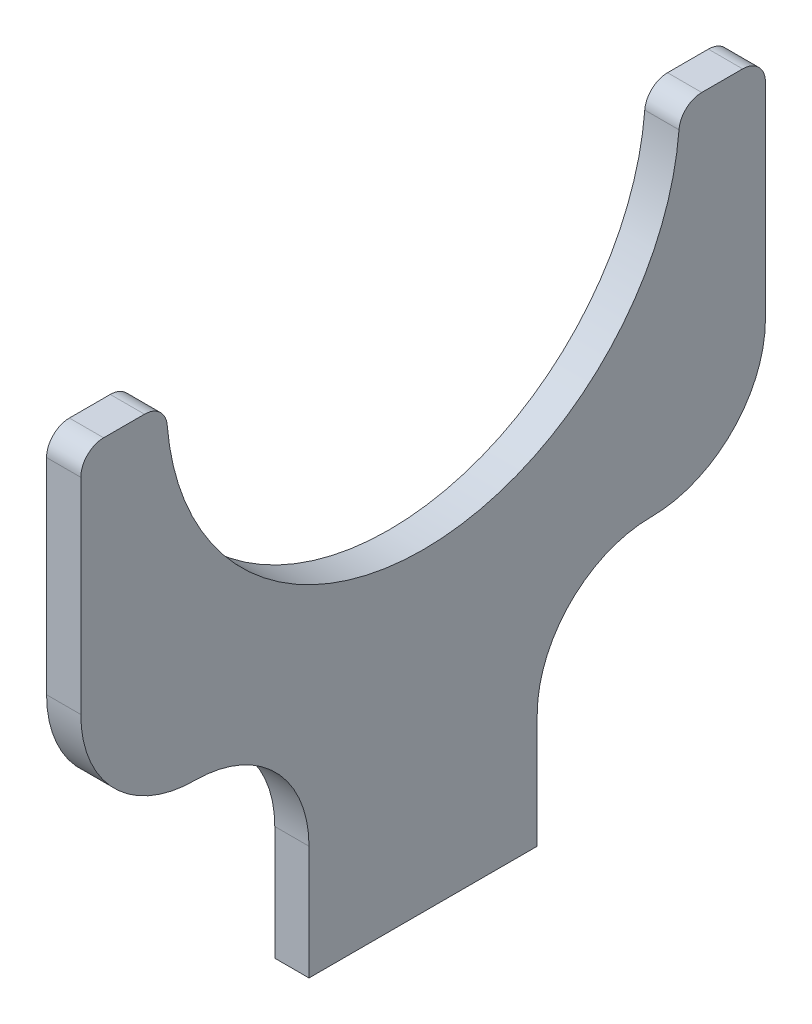
ISO-10303-21;
HEADER;
FILE_DESCRIPTION(('STEP AP214'),'2;1');
FILE_NAME('part.step','',(''),(''),'','','');
FILE_SCHEMA(('AUTOMOTIVE_DESIGN { 1 0 10303 214 1 1 1 1 }'));
ENDSEC;
DATA;
#1=APPLICATION_CONTEXT('core data for automotive mechanical design processes');
#2=APPLICATION_PROTOCOL_DEFINITION('international standard','automotive_design',2000,#1);
#3=PRODUCT_CONTEXT('',#1,'mechanical');
#4=PRODUCT('Part','Part','',(#3));
#5=PRODUCT_RELATED_PRODUCT_CATEGORY('part','',(#4));
#6=PRODUCT_DEFINITION_FORMATION('','',#4);
#7=PRODUCT_DEFINITION_CONTEXT('part definition',#1,'design');
#8=PRODUCT_DEFINITION('design','',#6,#7);
#9=PRODUCT_DEFINITION_SHAPE('','',#8);
#10=(LENGTH_UNIT() NAMED_UNIT(*) SI_UNIT(.MILLI.,.METRE.));
#11=(NAMED_UNIT(*) PLANE_ANGLE_UNIT() SI_UNIT($,.RADIAN.));
#12=(NAMED_UNIT(*) SI_UNIT($,.STERADIAN.) SOLID_ANGLE_UNIT());
#13=UNCERTAINTY_MEASURE_WITH_UNIT(LENGTH_MEASURE(1.E-05),#10,'distance_accuracy_value','');
#14=(GEOMETRIC_REPRESENTATION_CONTEXT(3) GLOBAL_UNCERTAINTY_ASSIGNED_CONTEXT((#13)) GLOBAL_UNIT_ASSIGNED_CONTEXT((#10,
#11,#12)) REPRESENTATION_CONTEXT('',''));
#15=CARTESIAN_POINT('',(0.,0.,0.));
#16=DIRECTION('',(0.,0.,1.));
#17=DIRECTION('',(1.,0.,0.));
#18=AXIS2_PLACEMENT_3D('',#15,#16,#17);
#19=CARTESIAN_POINT('',(3.,50.,0.));
#20=DIRECTION('',(0.,-1.,0.));
#21=DIRECTION('',(0.,0.,-1.));
#22=AXIS2_PLACEMENT_3D('',#19,#20,#21);
#23=PLANE('',#22);
#24=DIRECTION('',(0.,0.,1.));
#25=VECTOR('',#24,1.);
#26=CARTESIAN_POINT('',(3.,50.,0.));
#27=LINE('',#26,#25);
#28=CARTESIAN_POINT('',(3.,50.,-58.));
#29=VERTEX_POINT('',#28);
#30=CARTESIAN_POINT('',(3.,50.,-54.4182308941496));
#31=VERTEX_POINT('',#30);
#32=EDGE_CURVE('E189',#29,#31,#27,.T.);
#33=ORIENTED_EDGE('',*,*,#32,.F.);
#34=DIRECTION('',(-1.,0.,0.));
#35=VECTOR('',#34,1.);
#36=CARTESIAN_POINT('',(3.,50.,-58.));
#37=LINE('',#36,#35);
#38=CARTESIAN_POINT('',(0.,50.,-58.));
#39=VERTEX_POINT('',#38);
#40=EDGE_CURVE('E225',#29,#39,#37,.T.);
#41=ORIENTED_EDGE('',*,*,#40,.T.);
#42=DIRECTION('',(0.,0.,1.));
#43=VECTOR('',#42,1.);
#44=CARTESIAN_POINT('',(0.,50.,0.));
#45=LINE('',#44,#43);
#46=CARTESIAN_POINT('',(0.,50.,-54.4182308941496));
#47=VERTEX_POINT('',#46);
#48=EDGE_CURVE('E184',#39,#47,#45,.T.);
#49=ORIENTED_EDGE('',*,*,#48,.T.);
#50=DIRECTION('',(1.,0.,0.));
#51=VECTOR('',#50,1.);
#52=CARTESIAN_POINT('',(3.,50.,-54.4182308941496));
#53=LINE('',#52,#51);
#54=EDGE_CURVE('E215',#47,#31,#53,.T.);
#55=ORIENTED_EDGE('',*,*,#54,.T.);
#56=EDGE_LOOP('',(#33,#41,#49,#55));
#57=FACE_BOUND('',#56,.T.);
#58=ADVANCED_FACE('F33',(#57),#23,.F.);
#59=CARTESIAN_POINT('',(3.,0.,0.));
#60=DIRECTION('',(0.,0.,-1.));
#61=DIRECTION('',(-1.,0.,0.));
#62=AXIS2_PLACEMENT_3D('',#59,#60,#61);
#63=PLANE('',#62);
#64=DIRECTION('',(0.,-1.,0.));
#65=VECTOR('',#64,1.);
#66=CARTESIAN_POINT('',(3.,0.,0.));
#67=LINE('',#66,#65);
#68=CARTESIAN_POINT('',(3.,48.,0.));
#69=VERTEX_POINT('',#68);
#70=CARTESIAN_POINT('',(3.,30.,0.));
#71=VERTEX_POINT('',#70);
#72=EDGE_CURVE('E262',#69,#71,#67,.T.);
#73=ORIENTED_EDGE('',*,*,#72,.F.);
#74=DIRECTION('',(-1.,0.,0.));
#75=VECTOR('',#74,1.);
#76=CARTESIAN_POINT('',(3.,48.,0.));
#77=LINE('',#76,#75);
#78=CARTESIAN_POINT('',(0.,48.,0.));
#79=VERTEX_POINT('',#78);
#80=EDGE_CURVE('E11',#69,#79,#77,.T.);
#81=ORIENTED_EDGE('',*,*,#80,.T.);
#82=DIRECTION('',(0.,-1.,0.));
#83=VECTOR('',#82,1.);
#84=CARTESIAN_POINT('',(0.,0.,0.));
#85=LINE('',#84,#83);
#86=CARTESIAN_POINT('',(0.,30.,0.));
#87=VERTEX_POINT('',#86);
#88=EDGE_CURVE('E168',#79,#87,#85,.T.);
#89=ORIENTED_EDGE('',*,*,#88,.T.);
#90=DIRECTION('',(1.,0.,0.));
#91=VECTOR('',#90,1.);
#92=CARTESIAN_POINT('',(3.,30.,0.));
#93=LINE('',#92,#91);
#94=EDGE_CURVE('E204',#87,#71,#93,.T.);
#95=ORIENTED_EDGE('',*,*,#94,.T.);
#96=EDGE_LOOP('',(#73,#81,#89,#95));
#97=FACE_BOUND('',#96,.T.);
#98=ADVANCED_FACE('F261',(#97),#63,.F.);
#99=CARTESIAN_POINT('',(3.,0.,0.));
#100=DIRECTION('',(0.,1.,0.));
#101=DIRECTION('',(0.,0.,1.));
#102=AXIS2_PLACEMENT_3D('',#99,#100,#101);
#103=PLANE('',#102);
#104=DIRECTION('',(0.,0.,-1.));
#105=VECTOR('',#104,1.);
#106=CARTESIAN_POINT('',(3.,0.,0.));
#107=LINE('',#106,#105);
#108=CARTESIAN_POINT('',(3.,0.,-20.));
#109=VERTEX_POINT('',#108);
#110=CARTESIAN_POINT('',(3.,0.,-40.));
#111=VERTEX_POINT('',#110);
#112=EDGE_CURVE('E167',#109,#111,#107,.T.);
#113=ORIENTED_EDGE('',*,*,#112,.F.);
#114=DIRECTION('',(1.,0.,0.));
#115=VECTOR('',#114,1.);
#116=CARTESIAN_POINT('',(0.,0.,-20.));
#117=LINE('',#116,#115);
#118=CARTESIAN_POINT('',(0.,0.,-20.));
#119=VERTEX_POINT('',#118);
#120=EDGE_CURVE('E152',#119,#109,#117,.T.);
#121=ORIENTED_EDGE('',*,*,#120,.F.);
#122=DIRECTION('',(0.,0.,-1.));
#123=VECTOR('',#122,1.);
#124=CARTESIAN_POINT('',(0.,0.,0.));
#125=LINE('',#124,#123);
#126=CARTESIAN_POINT('',(0.,0.,-40.));
#127=VERTEX_POINT('',#126);
#128=EDGE_CURVE('E165',#119,#127,#125,.T.);
#129=ORIENTED_EDGE('',*,*,#128,.T.);
#130=DIRECTION('',(1.,0.,0.));
#131=VECTOR('',#130,1.);
#132=CARTESIAN_POINT('',(0.,0.,-40.));
#133=LINE('',#132,#131);
#134=EDGE_CURVE('E270',#127,#111,#133,.T.);
#135=ORIENTED_EDGE('',*,*,#134,.T.);
#136=EDGE_LOOP('',(#113,#121,#129,#135));
#137=FACE_BOUND('',#136,.T.);
#138=ADVANCED_FACE('F163',(#137),#103,.F.);
#139=CARTESIAN_POINT('',(3.,0.,-60.));
#140=DIRECTION('',(0.,0.,1.));
#141=DIRECTION('',(1.,0.,0.));
#142=AXIS2_PLACEMENT_3D('',#139,#140,#141);
#143=PLANE('',#142);
#144=DIRECTION('',(0.,1.,0.));
#145=VECTOR('',#144,1.);
#146=CARTESIAN_POINT('',(0.,0.,-60.));
#147=LINE('',#146,#145);
#148=CARTESIAN_POINT('',(0.,30.,-60.));
#149=VERTEX_POINT('',#148);
#150=CARTESIAN_POINT('',(0.,48.,-60.));
#151=VERTEX_POINT('',#150);
#152=EDGE_CURVE('E175',#149,#151,#147,.T.);
#153=ORIENTED_EDGE('',*,*,#152,.T.);
#154=DIRECTION('',(-1.,0.,0.));
#155=VECTOR('',#154,1.);
#156=CARTESIAN_POINT('',(3.,48.,-60.));
#157=LINE('',#156,#155);
#158=CARTESIAN_POINT('',(3.,48.,-60.));
#159=VERTEX_POINT('',#158);
#160=EDGE_CURVE('E236',#151,#159,#157,.F.);
#161=ORIENTED_EDGE('',*,*,#160,.T.);
#162=DIRECTION('',(0.,1.,0.));
#163=VECTOR('',#162,1.);
#164=CARTESIAN_POINT('',(3.,0.,-60.));
#165=LINE('',#164,#163);
#166=CARTESIAN_POINT('',(3.,30.,-60.));
#167=VERTEX_POINT('',#166);
#168=EDGE_CURVE('E266',#167,#159,#165,.T.);
#169=ORIENTED_EDGE('',*,*,#168,.F.);
#170=DIRECTION('',(1.,0.,0.));
#171=VECTOR('',#170,1.);
#172=CARTESIAN_POINT('',(3.,30.,-60.));
#173=LINE('',#172,#171);
#174=EDGE_CURVE('E196',#167,#149,#173,.F.);
#175=ORIENTED_EDGE('',*,*,#174,.T.);
#176=EDGE_LOOP('',(#153,#161,#169,#175));
#177=FACE_BOUND('',#176,.T.);
#178=ADVANCED_FACE('F289',(#177),#143,.F.);
#179=CARTESIAN_POINT('',(3.,50.,-5.58176910585045));
#180=VERTEX_POINT('',#179);
#181=CARTESIAN_POINT('',(3.,50.,-2.));
#182=VERTEX_POINT('',#181);
#183=EDGE_CURVE('E253',#180,#182,#27,.T.);
#184=ORIENTED_EDGE('',*,*,#183,.F.);
#185=DIRECTION('',(1.,0.,0.));
#186=VECTOR('',#185,1.);
#187=CARTESIAN_POINT('',(3.,50.,-5.58176910585045));
#188=LINE('',#187,#186);
#189=CARTESIAN_POINT('',(0.,50.,-5.58176910585045));
#190=VERTEX_POINT('',#189);
#191=EDGE_CURVE('E41',#180,#190,#188,.F.);
#192=ORIENTED_EDGE('',*,*,#191,.T.);
#193=CARTESIAN_POINT('',(0.,50.,-2.));
#194=VERTEX_POINT('',#193);
#195=EDGE_CURVE('E178',#190,#194,#45,.T.);
#196=ORIENTED_EDGE('',*,*,#195,.T.);
#197=DIRECTION('',(-1.,0.,0.));
#198=VECTOR('',#197,1.);
#199=CARTESIAN_POINT('',(3.,50.,-2.));
#200=LINE('',#199,#198);
#201=EDGE_CURVE('E56',#194,#182,#200,.F.);
#202=ORIENTED_EDGE('',*,*,#201,.T.);
#203=EDGE_LOOP('',(#184,#192,#196,#202));
#204=FACE_BOUND('',#203,.T.);
#205=ADVANCED_FACE('F252',(#204),#23,.F.);
#206=CARTESIAN_POINT('',(3.,0.,0.));
#207=DIRECTION('',(-1.,0.,0.));
#208=DIRECTION('',(0.,0.,1.));
#209=AXIS2_PLACEMENT_3D('',#206,#207,#208);
#210=PLANE('',#209);
#211=ORIENTED_EDGE('',*,*,#168,.T.);
#212=CARTESIAN_POINT('',(3.,48.,-58.));
#213=DIRECTION('',(-1.,0.,0.));
#214=DIRECTION('',(0.,0.,1.));
#215=AXIS2_PLACEMENT_3D('',#212,#213,#214);
#216=CIRCLE('',#215,2.);
#217=EDGE_CURVE('E243',#159,#29,#216,.F.);
#218=ORIENTED_EDGE('',*,*,#217,.T.);
#219=ORIENTED_EDGE('',*,*,#32,.T.);
#220=CARTESIAN_POINT('',(3.,48.,-54.4182308941496));
#221=DIRECTION('',(-1.,0.,0.));
#222=DIRECTION('',(0.,0.,1.));
#223=AXIS2_PLACEMENT_3D('',#220,#221,#222);
#224=CIRCLE('',#223,2.);
#225=CARTESIAN_POINT('',(3.,48.1632653061224,-52.4249059231986));
#226=VERTEX_POINT('',#225);
#227=EDGE_CURVE('E241',#31,#226,#224,.F.);
#228=ORIENTED_EDGE('',*,*,#227,.T.);
#229=CARTESIAN_POINT('',(3.,50.,-30.));
#230=DIRECTION('',(1.,0.,0.));
#231=DIRECTION('',(0.,0.,-1.));
#232=AXIS2_PLACEMENT_3D('',#229,#230,#231);
#233=CIRCLE('',#232,22.5);
#234=CARTESIAN_POINT('',(3.,48.1632653061224,-7.57509407680143));
#235=VERTEX_POINT('',#234);
#236=EDGE_CURVE('E219',#235,#226,#233,.T.);
#237=ORIENTED_EDGE('',*,*,#236,.F.);
#238=CARTESIAN_POINT('',(3.,48.,-5.58176910585045));
#239=DIRECTION('',(-1.,0.,0.));
#240=DIRECTION('',(0.,0.,1.));
#241=AXIS2_PLACEMENT_3D('',#238,#239,#240);
#242=CIRCLE('',#241,2.);
#243=EDGE_CURVE('E239',#235,#180,#242,.F.);
#244=ORIENTED_EDGE('',*,*,#243,.T.);
#245=ORIENTED_EDGE('',*,*,#183,.T.);
#246=CARTESIAN_POINT('',(3.,48.,-2.));
#247=DIRECTION('',(-1.,0.,0.));
#248=DIRECTION('',(0.,0.,1.));
#249=AXIS2_PLACEMENT_3D('',#246,#247,#248);
#250=CIRCLE('',#249,2.);
#251=EDGE_CURVE('E48',#182,#69,#250,.F.);
#252=ORIENTED_EDGE('',*,*,#251,.T.);
#253=ORIENTED_EDGE('',*,*,#72,.T.);
#254=CARTESIAN_POINT('',(3.,30.,-10.));
#255=DIRECTION('',(-1.,0.,0.));
#256=DIRECTION('',(0.,0.,1.));
#257=AXIS2_PLACEMENT_3D('',#254,#255,#256);
#258=CIRCLE('',#257,10.);
#259=CARTESIAN_POINT('',(3.,20.,-10.));
#260=VERTEX_POINT('',#259);
#261=EDGE_CURVE('E192',#71,#260,#258,.F.);
#262=ORIENTED_EDGE('',*,*,#261,.T.);
#263=CARTESIAN_POINT('',(3.,10.,-10.));
#264=DIRECTION('',(-1.,0.,0.));
#265=DIRECTION('',(0.,0.,1.));
#266=AXIS2_PLACEMENT_3D('',#263,#264,#265);
#267=CIRCLE('',#266,10.);
#268=CARTESIAN_POINT('',(3.,10.,-20.));
#269=VERTEX_POINT('',#268);
#270=EDGE_CURVE('E211',#260,#269,#267,.T.);
#271=ORIENTED_EDGE('',*,*,#270,.T.);
#272=DIRECTION('',(0.,1.,0.));
#273=VECTOR('',#272,1.);
#274=CARTESIAN_POINT('',(3.,0.,-20.));
#275=LINE('',#274,#273);
#276=EDGE_CURVE('E158',#109,#269,#275,.T.);
#277=ORIENTED_EDGE('',*,*,#276,.F.);
#278=ORIENTED_EDGE('',*,*,#112,.T.);
#279=DIRECTION('',(0.,-1.,0.));
#280=VECTOR('',#279,1.);
#281=CARTESIAN_POINT('',(3.,0.,-40.));
#282=LINE('',#281,#280);
#283=CARTESIAN_POINT('',(3.,10.,-40.));
#284=VERTEX_POINT('',#283);
#285=EDGE_CURVE('E302',#284,#111,#282,.T.);
#286=ORIENTED_EDGE('',*,*,#285,.F.);
#287=CARTESIAN_POINT('',(3.,10.,-50.));
#288=DIRECTION('',(-1.,0.,0.));
#289=DIRECTION('',(0.,0.,1.));
#290=AXIS2_PLACEMENT_3D('',#287,#288,#289);
#291=CIRCLE('',#290,10.);
#292=CARTESIAN_POINT('',(3.,20.,-50.));
#293=VERTEX_POINT('',#292);
#294=EDGE_CURVE('E207',#284,#293,#291,.T.);
#295=ORIENTED_EDGE('',*,*,#294,.T.);
#296=CARTESIAN_POINT('',(3.,30.,-50.));
#297=DIRECTION('',(-1.,0.,0.));
#298=DIRECTION('',(0.,0.,1.));
#299=AXIS2_PLACEMENT_3D('',#296,#297,#298);
#300=CIRCLE('',#299,10.);
#301=EDGE_CURVE('E194',#293,#167,#300,.F.);
#302=ORIENTED_EDGE('',*,*,#301,.T.);
#303=EDGE_LOOP('',(#211,#218,#219,#228,#237,#244,#245,#252,#253,#262,#271,#277,#278,#286,#295,#302));
#304=FACE_BOUND('',#303,.T.);
#305=ADVANCED_FACE('F276',(#304),#210,.F.);
#306=CARTESIAN_POINT('',(0.,0.,0.));
#307=DIRECTION('',(-1.,0.,0.));
#308=DIRECTION('',(0.,0.,1.));
#309=AXIS2_PLACEMENT_3D('',#306,#307,#308);
#310=PLANE('',#309);
#311=ORIENTED_EDGE('',*,*,#48,.F.);
#312=CARTESIAN_POINT('',(0.,48.,-58.));
#313=DIRECTION('',(-1.,0.,0.));
#314=DIRECTION('',(0.,0.,1.));
#315=AXIS2_PLACEMENT_3D('',#312,#313,#314);
#316=CIRCLE('',#315,2.);
#317=EDGE_CURVE('E234',#39,#151,#316,.T.);
#318=ORIENTED_EDGE('',*,*,#317,.T.);
#319=ORIENTED_EDGE('',*,*,#152,.F.);
#320=CARTESIAN_POINT('',(0.,30.,-50.));
#321=DIRECTION('',(-1.,0.,0.));
#322=DIRECTION('',(0.,0.,1.));
#323=AXIS2_PLACEMENT_3D('',#320,#321,#322);
#324=CIRCLE('',#323,10.);
#325=CARTESIAN_POINT('',(0.,20.,-50.));
#326=VERTEX_POINT('',#325);
#327=EDGE_CURVE('E201',#149,#326,#324,.T.);
#328=ORIENTED_EDGE('',*,*,#327,.T.);
#329=CARTESIAN_POINT('',(0.,10.,-50.));
#330=DIRECTION('',(-1.,0.,0.));
#331=DIRECTION('',(0.,0.,1.));
#332=AXIS2_PLACEMENT_3D('',#329,#330,#331);
#333=CIRCLE('',#332,10.);
#334=CARTESIAN_POINT('',(0.,10.,-40.));
#335=VERTEX_POINT('',#334);
#336=EDGE_CURVE('E209',#326,#335,#333,.F.);
#337=ORIENTED_EDGE('',*,*,#336,.T.);
#338=DIRECTION('',(0.,-1.,0.));
#339=VECTOR('',#338,1.);
#340=CARTESIAN_POINT('',(0.,0.,-40.));
#341=LINE('',#340,#339);
#342=EDGE_CURVE('E173',#335,#127,#341,.T.);
#343=ORIENTED_EDGE('',*,*,#342,.T.);
#344=ORIENTED_EDGE('',*,*,#128,.F.);
#345=DIRECTION('',(0.,1.,0.));
#346=VECTOR('',#345,1.);
#347=CARTESIAN_POINT('',(0.,0.,-20.));
#348=LINE('',#347,#346);
#349=CARTESIAN_POINT('',(0.,10.,-20.));
#350=VERTEX_POINT('',#349);
#351=EDGE_CURVE('E148',#119,#350,#348,.T.);
#352=ORIENTED_EDGE('',*,*,#351,.T.);
#353=CARTESIAN_POINT('',(0.,10.,-10.));
#354=DIRECTION('',(-1.,0.,0.));
#355=DIRECTION('',(0.,0.,1.));
#356=AXIS2_PLACEMENT_3D('',#353,#354,#355);
#357=CIRCLE('',#356,10.);
#358=CARTESIAN_POINT('',(0.,20.,-10.));
#359=VERTEX_POINT('',#358);
#360=EDGE_CURVE('E213',#350,#359,#357,.F.);
#361=ORIENTED_EDGE('',*,*,#360,.T.);
#362=CARTESIAN_POINT('',(0.,30.,-10.));
#363=DIRECTION('',(-1.,0.,0.));
#364=DIRECTION('',(0.,0.,1.));
#365=AXIS2_PLACEMENT_3D('',#362,#363,#364);
#366=CIRCLE('',#365,10.);
#367=EDGE_CURVE('E198',#359,#87,#366,.T.);
#368=ORIENTED_EDGE('',*,*,#367,.T.);
#369=ORIENTED_EDGE('',*,*,#88,.F.);
#370=CARTESIAN_POINT('',(0.,48.,-2.));
#371=DIRECTION('',(-1.,0.,0.));
#372=DIRECTION('',(0.,0.,1.));
#373=AXIS2_PLACEMENT_3D('',#370,#371,#372);
#374=CIRCLE('',#373,2.);
#375=EDGE_CURVE('E228',#79,#194,#374,.T.);
#376=ORIENTED_EDGE('',*,*,#375,.T.);
#377=ORIENTED_EDGE('',*,*,#195,.F.);
#378=CARTESIAN_POINT('',(0.,48.,-5.58176910585045));
#379=DIRECTION('',(-1.,0.,0.));
#380=DIRECTION('',(0.,0.,1.));
#381=AXIS2_PLACEMENT_3D('',#378,#379,#380);
#382=CIRCLE('',#381,2.);
#383=CARTESIAN_POINT('',(0.,48.1632653061224,-7.57509407680143));
#384=VERTEX_POINT('',#383);
#385=EDGE_CURVE('E230',#190,#384,#382,.T.);
#386=ORIENTED_EDGE('',*,*,#385,.T.);
#387=CARTESIAN_POINT('',(0.,50.,-30.));
#388=DIRECTION('',(-1.,0.,0.));
#389=DIRECTION('',(0.,0.,1.));
#390=AXIS2_PLACEMENT_3D('',#387,#388,#389);
#391=CIRCLE('',#390,22.5);
#392=CARTESIAN_POINT('',(0.,48.1632653061224,-52.4249059231986));
#393=VERTEX_POINT('',#392);
#394=EDGE_CURVE('E185',#393,#384,#391,.T.);
#395=ORIENTED_EDGE('',*,*,#394,.F.);
#396=CARTESIAN_POINT('',(0.,48.,-54.4182308941496));
#397=DIRECTION('',(-1.,0.,0.));
#398=DIRECTION('',(0.,0.,1.));
#399=AXIS2_PLACEMENT_3D('',#396,#397,#398);
#400=CIRCLE('',#399,2.);
#401=EDGE_CURVE('E232',#393,#47,#400,.T.);
#402=ORIENTED_EDGE('',*,*,#401,.T.);
#403=EDGE_LOOP('',(#311,#318,#319,#328,#337,#343,#344,#352,#361,#368,#369,#376,#377,#386,#395,#402));
#404=FACE_BOUND('',#403,.T.);
#405=ADVANCED_FACE('F171',(#404),#310,.T.);
#406=CARTESIAN_POINT('',(0.,0.,-40.));
#407=DIRECTION('',(0.,0.,1.));
#408=DIRECTION('',(1.,0.,0.));
#409=AXIS2_PLACEMENT_3D('',#406,#407,#408);
#410=PLANE('',#409);
#411=ORIENTED_EDGE('',*,*,#342,.F.);
#412=DIRECTION('',(1.,0.,0.));
#413=VECTOR('',#412,1.);
#414=CARTESIAN_POINT('',(3.,10.,-40.));
#415=LINE('',#414,#413);
#416=EDGE_CURVE('E188',#335,#284,#415,.T.);
#417=ORIENTED_EDGE('',*,*,#416,.T.);
#418=ORIENTED_EDGE('',*,*,#285,.T.);
#419=ORIENTED_EDGE('',*,*,#134,.F.);
#420=EDGE_LOOP('',(#411,#417,#418,#419));
#421=FACE_BOUND('',#420,.T.);
#422=ADVANCED_FACE('F300',(#421),#410,.F.);
#423=CARTESIAN_POINT('',(0.,0.,-20.));
#424=DIRECTION('',(0.,0.,-1.));
#425=DIRECTION('',(-1.,0.,0.));
#426=AXIS2_PLACEMENT_3D('',#423,#424,#425);
#427=PLANE('',#426);
#428=ORIENTED_EDGE('',*,*,#276,.T.);
#429=DIRECTION('',(1.,0.,0.));
#430=VECTOR('',#429,1.);
#431=CARTESIAN_POINT('',(0.,10.,-20.));
#432=LINE('',#431,#430);
#433=EDGE_CURVE('E155',#269,#350,#432,.F.);
#434=ORIENTED_EDGE('',*,*,#433,.T.);
#435=ORIENTED_EDGE('',*,*,#351,.F.);
#436=ORIENTED_EDGE('',*,*,#120,.T.);
#437=EDGE_LOOP('',(#428,#434,#435,#436));
#438=FACE_BOUND('',#437,.T.);
#439=ADVANCED_FACE('F151',(#438),#427,.F.);
#440=CARTESIAN_POINT('',(0.,50.,-30.));
#441=DIRECTION('',(1.,0.,0.));
#442=DIRECTION('',(0.,0.,-1.));
#443=AXIS2_PLACEMENT_3D('',#440,#441,#442);
#444=CYLINDRICAL_SURFACE('',#443,22.5);
#445=ORIENTED_EDGE('',*,*,#236,.T.);
#446=DIRECTION('',(1.,0.,0.));
#447=VECTOR('',#446,1.);
#448=CARTESIAN_POINT('',(0.,48.1632653061224,-52.4249059231986));
#449=LINE('',#448,#447);
#450=EDGE_CURVE('E247',#226,#393,#449,.F.);
#451=ORIENTED_EDGE('',*,*,#450,.T.);
#452=ORIENTED_EDGE('',*,*,#394,.T.);
#453=DIRECTION('',(1.,0.,0.));
#454=VECTOR('',#453,1.);
#455=CARTESIAN_POINT('',(0.,48.1632653061224,-7.57509407680143));
#456=LINE('',#455,#454);
#457=EDGE_CURVE('E245',#384,#235,#456,.T.);
#458=ORIENTED_EDGE('',*,*,#457,.T.);
#459=EDGE_LOOP('',(#445,#451,#452,#458));
#460=FACE_BOUND('',#459,.T.);
#461=ADVANCED_FACE('F343',(#460),#444,.F.);
#462=CARTESIAN_POINT('',(0.,30.,-50.));
#463=DIRECTION('',(1.,0.,0.));
#464=DIRECTION('',(0.,0.,-1.));
#465=AXIS2_PLACEMENT_3D('',#462,#463,#464);
#466=CYLINDRICAL_SURFACE('',#465,10.);
#467=DIRECTION('',(1.,0.,0.));
#468=VECTOR('',#467,1.);
#469=CARTESIAN_POINT('',(0.,20.,-50.));
#470=LINE('',#469,#468);
#471=EDGE_CURVE('E216',#326,#293,#470,.T.);
#472=ORIENTED_EDGE('',*,*,#471,.F.);
#473=ORIENTED_EDGE('',*,*,#327,.F.);
#474=ORIENTED_EDGE('',*,*,#174,.F.);
#475=ORIENTED_EDGE('',*,*,#301,.F.);
#476=EDGE_LOOP('',(#472,#473,#474,#475));
#477=FACE_BOUND('',#476,.T.);
#478=ADVANCED_FACE('F295',(#477),#466,.T.);
#479=CARTESIAN_POINT('',(0.,10.,-50.));
#480=DIRECTION('',(-1.,0.,0.));
#481=DIRECTION('',(0.,0.,1.));
#482=AXIS2_PLACEMENT_3D('',#479,#480,#481);
#483=CYLINDRICAL_SURFACE('',#482,10.);
#484=ORIENTED_EDGE('',*,*,#336,.F.);
#485=ORIENTED_EDGE('',*,*,#471,.T.);
#486=ORIENTED_EDGE('',*,*,#294,.F.);
#487=ORIENTED_EDGE('',*,*,#416,.F.);
#488=EDGE_LOOP('',(#484,#485,#486,#487));
#489=FACE_BOUND('',#488,.T.);
#490=ADVANCED_FACE('F304',(#489),#483,.F.);
#491=CARTESIAN_POINT('',(3.,30.,-10.));
#492=DIRECTION('',(1.,0.,0.));
#493=DIRECTION('',(0.,0.,-1.));
#494=AXIS2_PLACEMENT_3D('',#491,#492,#493);
#495=CYLINDRICAL_SURFACE('',#494,10.);
#496=ORIENTED_EDGE('',*,*,#94,.F.);
#497=ORIENTED_EDGE('',*,*,#367,.F.);
#498=DIRECTION('',(1.,0.,0.));
#499=VECTOR('',#498,1.);
#500=CARTESIAN_POINT('',(0.,20.,-10.));
#501=LINE('',#500,#499);
#502=EDGE_CURVE('E220',#260,#359,#501,.F.);
#503=ORIENTED_EDGE('',*,*,#502,.F.);
#504=ORIENTED_EDGE('',*,*,#261,.F.);
#505=EDGE_LOOP('',(#496,#497,#503,#504));
#506=FACE_BOUND('',#505,.T.);
#507=ADVANCED_FACE('F313',(#506),#495,.T.);
#508=CARTESIAN_POINT('',(0.,10.,-10.));
#509=DIRECTION('',(-1.,0.,0.));
#510=DIRECTION('',(0.,0.,1.));
#511=AXIS2_PLACEMENT_3D('',#508,#509,#510);
#512=CYLINDRICAL_SURFACE('',#511,10.);
#513=ORIENTED_EDGE('',*,*,#360,.F.);
#514=ORIENTED_EDGE('',*,*,#433,.F.);
#515=ORIENTED_EDGE('',*,*,#270,.F.);
#516=ORIENTED_EDGE('',*,*,#502,.T.);
#517=EDGE_LOOP('',(#513,#514,#515,#516));
#518=FACE_BOUND('',#517,.T.);
#519=ADVANCED_FACE('F309',(#518),#512,.F.);
#520=CARTESIAN_POINT('',(3.,48.,-58.));
#521=DIRECTION('',(-1.,0.,0.));
#522=DIRECTION('',(0.,0.,1.));
#523=AXIS2_PLACEMENT_3D('',#520,#521,#522);
#524=CYLINDRICAL_SURFACE('',#523,2.);
#525=ORIENTED_EDGE('',*,*,#217,.F.);
#526=ORIENTED_EDGE('',*,*,#160,.F.);
#527=ORIENTED_EDGE('',*,*,#317,.F.);
#528=ORIENTED_EDGE('',*,*,#40,.F.);
#529=EDGE_LOOP('',(#525,#526,#527,#528));
#530=FACE_BOUND('',#529,.T.);
#531=ADVANCED_FACE('F284',(#530),#524,.T.);
#532=CARTESIAN_POINT('',(0.,48.,-54.4182308941496));
#533=DIRECTION('',(1.,0.,0.));
#534=DIRECTION('',(0.,0.,-1.));
#535=AXIS2_PLACEMENT_3D('',#532,#533,#534);
#536=CYLINDRICAL_SURFACE('',#535,2.);
#537=ORIENTED_EDGE('',*,*,#401,.F.);
#538=ORIENTED_EDGE('',*,*,#450,.F.);
#539=ORIENTED_EDGE('',*,*,#227,.F.);
#540=ORIENTED_EDGE('',*,*,#54,.F.);
#541=EDGE_LOOP('',(#537,#538,#539,#540));
#542=FACE_BOUND('',#541,.T.);
#543=ADVANCED_FACE('F433',(#542),#536,.T.);
#544=CARTESIAN_POINT('',(0.,48.,-5.58176910585045));
#545=DIRECTION('',(1.,0.,0.));
#546=DIRECTION('',(0.,0.,-1.));
#547=AXIS2_PLACEMENT_3D('',#544,#545,#546);
#548=CYLINDRICAL_SURFACE('',#547,2.);
#549=ORIENTED_EDGE('',*,*,#243,.F.);
#550=ORIENTED_EDGE('',*,*,#457,.F.);
#551=ORIENTED_EDGE('',*,*,#385,.F.);
#552=ORIENTED_EDGE('',*,*,#191,.F.);
#553=EDGE_LOOP('',(#549,#550,#551,#552));
#554=FACE_BOUND('',#553,.T.);
#555=ADVANCED_FACE('F441',(#554),#548,.T.);
#556=CARTESIAN_POINT('',(3.,48.,-2.));
#557=DIRECTION('',(-1.,0.,0.));
#558=DIRECTION('',(0.,0.,1.));
#559=AXIS2_PLACEMENT_3D('',#556,#557,#558);
#560=CYLINDRICAL_SURFACE('',#559,2.);
#561=ORIENTED_EDGE('',*,*,#251,.F.);
#562=ORIENTED_EDGE('',*,*,#201,.F.);
#563=ORIENTED_EDGE('',*,*,#375,.F.);
#564=ORIENTED_EDGE('',*,*,#80,.F.);
#565=EDGE_LOOP('',(#561,#562,#563,#564));
#566=FACE_BOUND('',#565,.T.);
#567=ADVANCED_FACE('F35',(#566),#560,.T.);
#568=CLOSED_SHELL('',(#58,#98,#138,#178,#205,#305,#405,#422,#439,#461,#478,#490,#507,#519,#531,
#543,#555,#567));
#569=MANIFOLD_SOLID_BREP('B2',#568);
#570=ADVANCED_BREP_SHAPE_REPRESENTATION('',(#18,#569),#14);
#571=SHAPE_DEFINITION_REPRESENTATION(#9,#570);
ENDSEC;
END-ISO-10303-21;
